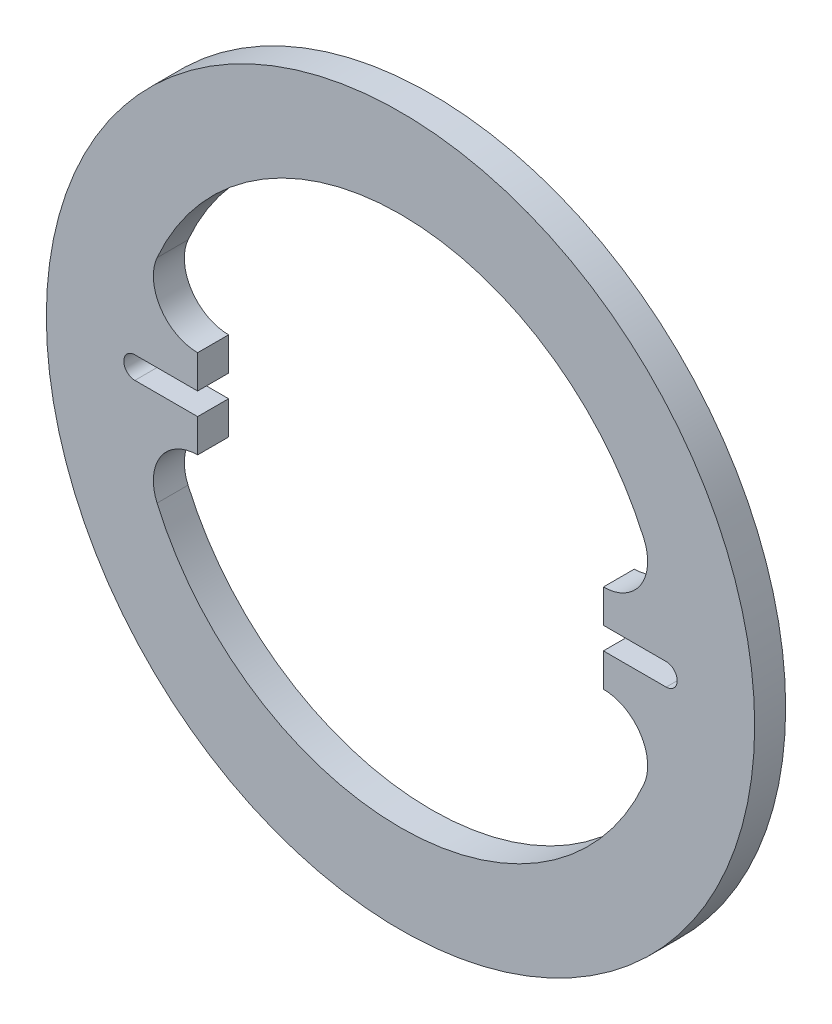
ISO-10303-21;
HEADER;
FILE_DESCRIPTION(('STEP AP214'),'2;1');
FILE_NAME('part.step','',(''),(''),'','','');
FILE_SCHEMA(('AUTOMOTIVE_DESIGN { 1 0 10303 214 1 1 1 1 }'));
ENDSEC;
DATA;
#1=APPLICATION_CONTEXT('core data for automotive mechanical design processes');
#2=APPLICATION_PROTOCOL_DEFINITION('international standard','automotive_design',2000,#1);
#3=PRODUCT_CONTEXT('',#1,'mechanical');
#4=PRODUCT('Part','Part','',(#3));
#5=PRODUCT_RELATED_PRODUCT_CATEGORY('part','',(#4));
#6=PRODUCT_DEFINITION_FORMATION('','',#4);
#7=PRODUCT_DEFINITION_CONTEXT('part definition',#1,'design');
#8=PRODUCT_DEFINITION('design','',#6,#7);
#9=PRODUCT_DEFINITION_SHAPE('','',#8);
#10=(LENGTH_UNIT() NAMED_UNIT(*) SI_UNIT(.MILLI.,.METRE.));
#11=(NAMED_UNIT(*) PLANE_ANGLE_UNIT() SI_UNIT($,.RADIAN.));
#12=(NAMED_UNIT(*) SI_UNIT($,.STERADIAN.) SOLID_ANGLE_UNIT());
#13=UNCERTAINTY_MEASURE_WITH_UNIT(LENGTH_MEASURE(1.E-05),#10,'distance_accuracy_value','');
#14=(GEOMETRIC_REPRESENTATION_CONTEXT(3) GLOBAL_UNCERTAINTY_ASSIGNED_CONTEXT((#13)) GLOBAL_UNIT_ASSIGNED_CONTEXT((#10,
#11,#12)) REPRESENTATION_CONTEXT('',''));
#15=CARTESIAN_POINT('',(0.,0.,0.));
#16=DIRECTION('',(0.,0.,1.));
#17=DIRECTION('',(1.,0.,0.));
#18=AXIS2_PLACEMENT_3D('',#15,#16,#17);
#19=CARTESIAN_POINT('',(0.,0.,8.89));
#20=DIRECTION('',(0.,0.,1.));
#21=DIRECTION('',(1.,0.,0.));
#22=AXIS2_PLACEMENT_3D('',#19,#20,#21);
#23=PLANE('',#22);
#24=DIRECTION('',(0.,-1.,0.));
#25=VECTOR('',#24,1.);
#26=CARTESIAN_POINT('',(-58.1987113259392,-12.7,8.89));
#27=LINE('',#26,#25);
#28=CARTESIAN_POINT('',(-58.198711325939,12.7,8.89));
#29=VERTEX_POINT('',#28);
#30=CARTESIAN_POINT('',(-58.1987113259392,3.17500000000001,8.89));
#31=VERTEX_POINT('',#30);
#32=EDGE_CURVE('E48',#29,#31,#27,.T.);
#33=ORIENTED_EDGE('',*,*,#32,.F.);
#34=CARTESIAN_POINT('',(-58.1987113259392,25.4,8.89));
#35=DIRECTION('',(0.,0.,1.));
#36=DIRECTION('',(1.,0.,0.));
#37=AXIS2_PLACEMENT_3D('',#34,#35,#36);
#38=CIRCLE('',#37,12.7);
#39=CARTESIAN_POINT('',(-69.838453591127,30.48,8.89));
#40=VERTEX_POINT('',#39);
#41=EDGE_CURVE('E196',#40,#29,#38,.T.);
#42=ORIENTED_EDGE('',*,*,#41,.F.);
#43=CARTESIAN_POINT('',(0.,0.,8.89));
#44=DIRECTION('',(0.,0.,1.));
#45=DIRECTION('',(1.,0.,0.));
#46=AXIS2_PLACEMENT_3D('',#43,#44,#45);
#47=CIRCLE('',#46,76.2);
#48=CARTESIAN_POINT('',(69.838453591127,30.48,8.89));
#49=VERTEX_POINT('',#48);
#50=EDGE_CURVE('E203',#49,#40,#47,.T.);
#51=ORIENTED_EDGE('',*,*,#50,.F.);
#52=CARTESIAN_POINT('',(58.1987113259392,25.4,8.89));
#53=DIRECTION('',(0.,0.,1.));
#54=DIRECTION('',(1.,0.,0.));
#55=AXIS2_PLACEMENT_3D('',#52,#53,#54);
#56=CIRCLE('',#55,12.7);
#57=CARTESIAN_POINT('',(58.1987113259393,12.7,8.89));
#58=VERTEX_POINT('',#57);
#59=EDGE_CURVE('E191',#58,#49,#56,.T.);
#60=ORIENTED_EDGE('',*,*,#59,.F.);
#61=DIRECTION('',(0.,1.,0.));
#62=VECTOR('',#61,1.);
#63=CARTESIAN_POINT('',(58.1987113259393,12.7,8.89));
#64=LINE('',#63,#62);
#65=CARTESIAN_POINT('',(58.1987113259392,3.175,8.89));
#66=VERTEX_POINT('',#65);
#67=EDGE_CURVE('E285',#66,#58,#64,.T.);
#68=ORIENTED_EDGE('',*,*,#67,.F.);
#69=DIRECTION('',(-1.,0.,0.));
#70=VECTOR('',#69,1.);
#71=CARTESIAN_POINT('',(76.2,3.17500000000001,8.89));
#72=LINE('',#71,#70);
#73=CARTESIAN_POINT('',(76.2,3.17500000000001,8.89));
#74=VERTEX_POINT('',#73);
#75=EDGE_CURVE('E226',#74,#66,#72,.T.);
#76=ORIENTED_EDGE('',*,*,#75,.F.);
#77=CARTESIAN_POINT('',(76.2,0.,8.89));
#78=DIRECTION('',(0.,0.,1.));
#79=DIRECTION('',(1.,0.,0.));
#80=AXIS2_PLACEMENT_3D('',#77,#78,#79);
#81=CIRCLE('',#80,3.17500000000001);
#82=CARTESIAN_POINT('',(76.2,-3.175,8.89));
#83=VERTEX_POINT('',#82);
#84=EDGE_CURVE('E241',#83,#74,#81,.T.);
#85=ORIENTED_EDGE('',*,*,#84,.F.);
#86=DIRECTION('',(1.,0.,0.));
#87=VECTOR('',#86,1.);
#88=CARTESIAN_POINT('',(76.2,-3.175,8.89));
#89=LINE('',#88,#87);
#90=CARTESIAN_POINT('',(58.1987113259393,-3.17500000000001,8.89));
#91=VERTEX_POINT('',#90);
#92=EDGE_CURVE('E237',#91,#83,#89,.T.);
#93=ORIENTED_EDGE('',*,*,#92,.F.);
#94=CARTESIAN_POINT('',(58.1987113259391,-12.7,8.89));
#95=VERTEX_POINT('',#94);
#96=EDGE_CURVE('E283',#95,#91,#64,.T.);
#97=ORIENTED_EDGE('',*,*,#96,.F.);
#98=CARTESIAN_POINT('',(58.1987113259392,-25.4,8.89));
#99=DIRECTION('',(0.,0.,-1.));
#100=DIRECTION('',(1.,0.,0.));
#101=AXIS2_PLACEMENT_3D('',#98,#99,#100);
#102=CIRCLE('',#101,12.7);
#103=CARTESIAN_POINT('',(69.838453591127,-30.48,8.89));
#104=VERTEX_POINT('',#103);
#105=EDGE_CURVE('E162',#95,#104,#102,.T.);
#106=ORIENTED_EDGE('',*,*,#105,.T.);
#107=CARTESIAN_POINT('',(0.,0.,8.89));
#108=DIRECTION('',(0.,0.,-1.));
#109=DIRECTION('',(1.,0.,0.));
#110=AXIS2_PLACEMENT_3D('',#107,#108,#109);
#111=CIRCLE('',#110,76.2);
#112=CARTESIAN_POINT('',(-69.838453591127,-30.48,8.89));
#113=VERTEX_POINT('',#112);
#114=EDGE_CURVE('E172',#104,#113,#111,.T.);
#115=ORIENTED_EDGE('',*,*,#114,.T.);
#116=CARTESIAN_POINT('',(-58.1987113259392,-25.4,8.89));
#117=DIRECTION('',(0.,0.,-1.));
#118=DIRECTION('',(1.,0.,0.));
#119=AXIS2_PLACEMENT_3D('',#116,#117,#118);
#120=CIRCLE('',#119,12.7);
#121=CARTESIAN_POINT('',(-58.1987113259392,-12.7,8.89));
#122=VERTEX_POINT('',#121);
#123=EDGE_CURVE('E177',#113,#122,#120,.T.);
#124=ORIENTED_EDGE('',*,*,#123,.T.);
#125=CARTESIAN_POINT('',(-58.1987113259392,-3.17500000000001,8.89));
#126=VERTEX_POINT('',#125);
#127=EDGE_CURVE('E280',#126,#122,#27,.T.);
#128=ORIENTED_EDGE('',*,*,#127,.F.);
#129=DIRECTION('',(1.,0.,0.));
#130=VECTOR('',#129,1.);
#131=CARTESIAN_POINT('',(-76.2,-3.175,8.89));
#132=LINE('',#131,#130);
#133=CARTESIAN_POINT('',(-76.2,-3.175,8.89));
#134=VERTEX_POINT('',#133);
#135=EDGE_CURVE('E262',#134,#126,#132,.T.);
#136=ORIENTED_EDGE('',*,*,#135,.F.);
#137=CARTESIAN_POINT('',(-76.2,0.,8.89));
#138=DIRECTION('',(0.,0.,1.));
#139=DIRECTION('',(-1.,0.,0.));
#140=AXIS2_PLACEMENT_3D('',#137,#138,#139);
#141=CIRCLE('',#140,3.17500000000001);
#142=CARTESIAN_POINT('',(-76.2,3.17500000000001,8.89));
#143=VERTEX_POINT('',#142);
#144=EDGE_CURVE('E259',#143,#134,#141,.T.);
#145=ORIENTED_EDGE('',*,*,#144,.F.);
#146=DIRECTION('',(-1.,0.,0.));
#147=VECTOR('',#146,1.);
#148=CARTESIAN_POINT('',(-76.2,3.17500000000001,8.89));
#149=LINE('',#148,#147);
#150=EDGE_CURVE('E254',#31,#143,#149,.T.);
#151=ORIENTED_EDGE('',*,*,#150,.F.);
#152=EDGE_LOOP('',(#33,#42,#51,#60,#68,#76,#85,#93,#97,#106,#115,#124,#128,#136,#145,#151));
#153=FACE_BOUND('',#152,.T.);
#154=CARTESIAN_POINT('',(0.,0.,8.89));
#155=DIRECTION('',(0.,0.,1.));
#156=DIRECTION('',(1.,0.,0.));
#157=AXIS2_PLACEMENT_3D('',#154,#155,#156);
#158=CIRCLE('',#157,101.6);
#159=CARTESIAN_POINT('',(101.6,0.,8.89));
#160=VERTEX_POINT('',#159);
#161=EDGE_CURVE('E213',#160,#160,#158,.T.);
#162=ORIENTED_EDGE('',*,*,#161,.T.);
#163=EDGE_LOOP('',(#162));
#164=FACE_BOUND('',#163,.T.);
#165=ADVANCED_FACE('F33',(#153,#164),#23,.T.);
#166=CARTESIAN_POINT('',(0.,0.,0.));
#167=DIRECTION('',(0.,0.,1.));
#168=DIRECTION('',(1.,0.,0.));
#169=AXIS2_PLACEMENT_3D('',#166,#167,#168);
#170=PLANE('',#169);
#171=CARTESIAN_POINT('',(0.,0.,0.));
#172=DIRECTION('',(0.,0.,1.));
#173=DIRECTION('',(1.,0.,0.));
#174=AXIS2_PLACEMENT_3D('',#171,#172,#173);
#175=CIRCLE('',#174,101.6);
#176=CARTESIAN_POINT('',(101.6,0.,0.));
#177=VERTEX_POINT('',#176);
#178=EDGE_CURVE('E210',#177,#177,#175,.T.);
#179=ORIENTED_EDGE('',*,*,#178,.F.);
#180=EDGE_LOOP('',(#179));
#181=FACE_BOUND('',#180,.T.);
#182=CARTESIAN_POINT('',(-58.1987113259392,25.4,0.));
#183=DIRECTION('',(0.,0.,1.));
#184=DIRECTION('',(1.,0.,0.));
#185=AXIS2_PLACEMENT_3D('',#182,#183,#184);
#186=CIRCLE('',#185,12.7);
#187=CARTESIAN_POINT('',(-69.838453591127,30.48,0.));
#188=VERTEX_POINT('',#187);
#189=CARTESIAN_POINT('',(-58.198711325939,12.7,0.));
#190=VERTEX_POINT('',#189);
#191=EDGE_CURVE('E199',#188,#190,#186,.T.);
#192=ORIENTED_EDGE('',*,*,#191,.T.);
#193=DIRECTION('',(0.,-1.,0.));
#194=VECTOR('',#193,1.);
#195=CARTESIAN_POINT('',(-58.1987113259392,-12.7,0.));
#196=LINE('',#195,#194);
#197=CARTESIAN_POINT('',(-58.1987113259391,3.175,0.));
#198=VERTEX_POINT('',#197);
#199=EDGE_CURVE('E164',#190,#198,#196,.T.);
#200=ORIENTED_EDGE('',*,*,#199,.T.);
#201=DIRECTION('',(-1.,0.,0.));
#202=VECTOR('',#201,1.);
#203=CARTESIAN_POINT('',(-76.2,3.17500000000001,0.));
#204=LINE('',#203,#202);
#205=CARTESIAN_POINT('',(-76.2,3.17500000000001,0.));
#206=VERTEX_POINT('',#205);
#207=EDGE_CURVE('E257',#198,#206,#204,.T.);
#208=ORIENTED_EDGE('',*,*,#207,.T.);
#209=CARTESIAN_POINT('',(-76.2,0.,0.));
#210=DIRECTION('',(0.,0.,1.));
#211=DIRECTION('',(-1.,0.,0.));
#212=AXIS2_PLACEMENT_3D('',#209,#210,#211);
#213=CIRCLE('',#212,3.17500000000001);
#214=CARTESIAN_POINT('',(-76.2,-3.175,0.));
#215=VERTEX_POINT('',#214);
#216=EDGE_CURVE('E250',#206,#215,#213,.T.);
#217=ORIENTED_EDGE('',*,*,#216,.T.);
#218=DIRECTION('',(1.,0.,0.));
#219=VECTOR('',#218,1.);
#220=CARTESIAN_POINT('',(-76.2,-3.175,0.));
#221=LINE('',#220,#219);
#222=CARTESIAN_POINT('',(-58.1987113259392,-3.17500000000001,0.));
#223=VERTEX_POINT('',#222);
#224=EDGE_CURVE('E253',#215,#223,#221,.T.);
#225=ORIENTED_EDGE('',*,*,#224,.T.);
#226=CARTESIAN_POINT('',(-58.1987113259392,-12.7,0.));
#227=VERTEX_POINT('',#226);
#228=EDGE_CURVE('E56',#223,#227,#196,.T.);
#229=ORIENTED_EDGE('',*,*,#228,.T.);
#230=CARTESIAN_POINT('',(-58.1987113259392,-25.4,0.));
#231=DIRECTION('',(0.,0.,-1.));
#232=DIRECTION('',(1.,0.,0.));
#233=AXIS2_PLACEMENT_3D('',#230,#231,#232);
#234=CIRCLE('',#233,12.7);
#235=CARTESIAN_POINT('',(-69.838453591127,-30.48,0.));
#236=VERTEX_POINT('',#235);
#237=EDGE_CURVE('E171',#236,#227,#234,.T.);
#238=ORIENTED_EDGE('',*,*,#237,.F.);
#239=CARTESIAN_POINT('',(0.,0.,0.));
#240=DIRECTION('',(0.,0.,-1.));
#241=DIRECTION('',(1.,0.,0.));
#242=AXIS2_PLACEMENT_3D('',#239,#240,#241);
#243=CIRCLE('',#242,76.2);
#244=CARTESIAN_POINT('',(69.838453591127,-30.48,0.));
#245=VERTEX_POINT('',#244);
#246=EDGE_CURVE('E170',#245,#236,#243,.T.);
#247=ORIENTED_EDGE('',*,*,#246,.F.);
#248=CARTESIAN_POINT('',(58.1987113259392,-25.4,0.));
#249=DIRECTION('',(0.,0.,-1.));
#250=DIRECTION('',(1.,0.,0.));
#251=AXIS2_PLACEMENT_3D('',#248,#249,#250);
#252=CIRCLE('',#251,12.7);
#253=CARTESIAN_POINT('',(58.1987113259391,-12.7,0.));
#254=VERTEX_POINT('',#253);
#255=EDGE_CURVE('E160',#254,#245,#252,.T.);
#256=ORIENTED_EDGE('',*,*,#255,.F.);
#257=DIRECTION('',(0.,1.,0.));
#258=VECTOR('',#257,1.);
#259=CARTESIAN_POINT('',(58.1987113259393,12.7,0.));
#260=LINE('',#259,#258);
#261=CARTESIAN_POINT('',(58.1987113259392,-3.17500000000001,0.));
#262=VERTEX_POINT('',#261);
#263=EDGE_CURVE('E144',#254,#262,#260,.T.);
#264=ORIENTED_EDGE('',*,*,#263,.T.);
#265=DIRECTION('',(1.,0.,0.));
#266=VECTOR('',#265,1.);
#267=CARTESIAN_POINT('',(76.2,-3.175,0.));
#268=LINE('',#267,#266);
#269=CARTESIAN_POINT('',(76.2,-3.175,0.));
#270=VERTEX_POINT('',#269);
#271=EDGE_CURVE('E233',#262,#270,#268,.T.);
#272=ORIENTED_EDGE('',*,*,#271,.T.);
#273=CARTESIAN_POINT('',(76.2,0.,0.));
#274=DIRECTION('',(0.,0.,1.));
#275=DIRECTION('',(1.,0.,0.));
#276=AXIS2_PLACEMENT_3D('',#273,#274,#275);
#277=CIRCLE('',#276,3.17500000000001);
#278=CARTESIAN_POINT('',(76.2,3.17500000000001,0.));
#279=VERTEX_POINT('',#278);
#280=EDGE_CURVE('E232',#270,#279,#277,.T.);
#281=ORIENTED_EDGE('',*,*,#280,.T.);
#282=DIRECTION('',(-1.,0.,0.));
#283=VECTOR('',#282,1.);
#284=CARTESIAN_POINT('',(76.2,3.17500000000001,0.));
#285=LINE('',#284,#283);
#286=CARTESIAN_POINT('',(58.1987113259393,3.17500000000001,0.));
#287=VERTEX_POINT('',#286);
#288=EDGE_CURVE('E223',#279,#287,#285,.T.);
#289=ORIENTED_EDGE('',*,*,#288,.T.);
#290=CARTESIAN_POINT('',(58.1987113259393,12.7,0.));
#291=VERTEX_POINT('',#290);
#292=EDGE_CURVE('E154',#287,#291,#260,.T.);
#293=ORIENTED_EDGE('',*,*,#292,.T.);
#294=CARTESIAN_POINT('',(58.1987113259392,25.4,0.));
#295=DIRECTION('',(0.,0.,1.));
#296=DIRECTION('',(1.,0.,0.));
#297=AXIS2_PLACEMENT_3D('',#294,#295,#296);
#298=CIRCLE('',#297,12.7);
#299=CARTESIAN_POINT('',(69.838453591127,30.48,0.));
#300=VERTEX_POINT('',#299);
#301=EDGE_CURVE('E193',#291,#300,#298,.T.);
#302=ORIENTED_EDGE('',*,*,#301,.T.);
#303=CARTESIAN_POINT('',(0.,0.,0.));
#304=DIRECTION('',(0.,0.,1.));
#305=DIRECTION('',(1.,0.,0.));
#306=AXIS2_PLACEMENT_3D('',#303,#304,#305);
#307=CIRCLE('',#306,76.2);
#308=EDGE_CURVE('E195',#300,#188,#307,.T.);
#309=ORIENTED_EDGE('',*,*,#308,.T.);
#310=EDGE_LOOP('',(#192,#200,#208,#217,#225,#229,#238,#247,#256,#264,#272,#281,#289,#293,#302,#309));
#311=FACE_BOUND('',#310,.T.);
#312=ADVANCED_FACE('F168',(#181,#311),#170,.F.);
#313=CARTESIAN_POINT('',(0.,0.,8.89));
#314=DIRECTION('',(0.,0.,-1.));
#315=DIRECTION('',(-1.,0.,0.));
#316=AXIS2_PLACEMENT_3D('',#313,#314,#315);
#317=CYLINDRICAL_SURFACE('',#316,101.6);
#318=ORIENTED_EDGE('',*,*,#161,.F.);
#319=EDGE_LOOP('',(#318));
#320=FACE_BOUND('',#319,.T.);
#321=ORIENTED_EDGE('',*,*,#178,.T.);
#322=EDGE_LOOP('',(#321));
#323=FACE_BOUND('',#322,.T.);
#324=ADVANCED_FACE('F35',(#320,#323),#317,.T.);
#325=CARTESIAN_POINT('',(58.1987113259392,25.4,0.));
#326=DIRECTION('',(0.,0.,1.));
#327=DIRECTION('',(1.,0.,0.));
#328=AXIS2_PLACEMENT_3D('',#325,#326,#327);
#329=CYLINDRICAL_SURFACE('',#328,12.7);
#330=ORIENTED_EDGE('',*,*,#301,.F.);
#331=DIRECTION('',(0.,0.,1.));
#332=VECTOR('',#331,1.);
#333=CARTESIAN_POINT('',(58.1987113259393,12.7,0.));
#334=LINE('',#333,#332);
#335=EDGE_CURVE('E163',#291,#58,#334,.T.);
#336=ORIENTED_EDGE('',*,*,#335,.T.);
#337=ORIENTED_EDGE('',*,*,#59,.T.);
#338=DIRECTION('',(0.,0.,1.));
#339=VECTOR('',#338,1.);
#340=CARTESIAN_POINT('',(69.838453591127,30.48,0.));
#341=LINE('',#340,#339);
#342=EDGE_CURVE('E201',#300,#49,#341,.T.);
#343=ORIENTED_EDGE('',*,*,#342,.F.);
#344=EDGE_LOOP('',(#330,#336,#337,#343));
#345=FACE_BOUND('',#344,.T.);
#346=ADVANCED_FACE('F311',(#345),#329,.F.);
#347=CARTESIAN_POINT('',(-58.1987113259392,25.4,0.));
#348=DIRECTION('',(0.,0.,1.));
#349=DIRECTION('',(1.,0.,0.));
#350=AXIS2_PLACEMENT_3D('',#347,#348,#349);
#351=CYLINDRICAL_SURFACE('',#350,12.7);
#352=ORIENTED_EDGE('',*,*,#41,.T.);
#353=DIRECTION('',(0.,0.,1.));
#354=VECTOR('',#353,1.);
#355=CARTESIAN_POINT('',(-58.198711325939,12.7,0.));
#356=LINE('',#355,#354);
#357=EDGE_CURVE('E291',#190,#29,#356,.T.);
#358=ORIENTED_EDGE('',*,*,#357,.F.);
#359=ORIENTED_EDGE('',*,*,#191,.F.);
#360=DIRECTION('',(0.,0.,1.));
#361=VECTOR('',#360,1.);
#362=CARTESIAN_POINT('',(-69.838453591127,30.48,0.));
#363=LINE('',#362,#361);
#364=EDGE_CURVE('E208',#188,#40,#363,.T.);
#365=ORIENTED_EDGE('',*,*,#364,.T.);
#366=EDGE_LOOP('',(#352,#358,#359,#365));
#367=FACE_BOUND('',#366,.T.);
#368=ADVANCED_FACE('F303',(#367),#351,.F.);
#369=CARTESIAN_POINT('',(0.,0.,0.));
#370=DIRECTION('',(0.,0.,1.));
#371=DIRECTION('',(1.,0.,0.));
#372=AXIS2_PLACEMENT_3D('',#369,#370,#371);
#373=CYLINDRICAL_SURFACE('',#372,76.2);
#374=ORIENTED_EDGE('',*,*,#50,.T.);
#375=ORIENTED_EDGE('',*,*,#364,.F.);
#376=ORIENTED_EDGE('',*,*,#308,.F.);
#377=ORIENTED_EDGE('',*,*,#342,.T.);
#378=EDGE_LOOP('',(#374,#375,#376,#377));
#379=FACE_BOUND('',#378,.T.);
#380=ADVANCED_FACE('F307',(#379),#373,.F.);
#381=CARTESIAN_POINT('',(58.1987113259392,-25.4,0.));
#382=DIRECTION('',(0.,0.,1.));
#383=DIRECTION('',(1.,0.,0.));
#384=AXIS2_PLACEMENT_3D('',#381,#382,#383);
#385=CYLINDRICAL_SURFACE('',#384,12.7);
#386=DIRECTION('',(0.,0.,1.));
#387=VECTOR('',#386,1.);
#388=CARTESIAN_POINT('',(58.1987113259391,-12.7,0.));
#389=LINE('',#388,#387);
#390=EDGE_CURVE('E147',#254,#95,#389,.T.);
#391=ORIENTED_EDGE('',*,*,#390,.F.);
#392=ORIENTED_EDGE('',*,*,#255,.T.);
#393=DIRECTION('',(0.,0.,1.));
#394=VECTOR('',#393,1.);
#395=CARTESIAN_POINT('',(69.838453591127,-30.48,0.));
#396=LINE('',#395,#394);
#397=EDGE_CURVE('E189',#245,#104,#396,.T.);
#398=ORIENTED_EDGE('',*,*,#397,.T.);
#399=ORIENTED_EDGE('',*,*,#105,.F.);
#400=EDGE_LOOP('',(#391,#392,#398,#399));
#401=FACE_BOUND('',#400,.T.);
#402=ADVANCED_FACE('F158',(#401),#385,.F.);
#403=CARTESIAN_POINT('',(0.,0.,0.));
#404=DIRECTION('',(0.,0.,1.));
#405=DIRECTION('',(1.,0.,0.));
#406=AXIS2_PLACEMENT_3D('',#403,#404,#405);
#407=CYLINDRICAL_SURFACE('',#406,76.2);
#408=ORIENTED_EDGE('',*,*,#114,.F.);
#409=ORIENTED_EDGE('',*,*,#397,.F.);
#410=ORIENTED_EDGE('',*,*,#246,.T.);
#411=DIRECTION('',(0.,0.,1.));
#412=VECTOR('',#411,1.);
#413=CARTESIAN_POINT('',(-69.838453591127,-30.48,0.));
#414=LINE('',#413,#412);
#415=EDGE_CURVE('E184',#236,#113,#414,.T.);
#416=ORIENTED_EDGE('',*,*,#415,.T.);
#417=EDGE_LOOP('',(#408,#409,#410,#416));
#418=FACE_BOUND('',#417,.T.);
#419=ADVANCED_FACE('F318',(#418),#407,.F.);
#420=CARTESIAN_POINT('',(-58.1987113259392,-25.4,0.));
#421=DIRECTION('',(0.,0.,1.));
#422=DIRECTION('',(1.,0.,0.));
#423=AXIS2_PLACEMENT_3D('',#420,#421,#422);
#424=CYLINDRICAL_SURFACE('',#423,12.7);
#425=DIRECTION('',(0.,0.,1.));
#426=VECTOR('',#425,1.);
#427=CARTESIAN_POINT('',(-58.1987113259392,-12.7,0.));
#428=LINE('',#427,#426);
#429=EDGE_CURVE('E289',#227,#122,#428,.T.);
#430=ORIENTED_EDGE('',*,*,#429,.T.);
#431=ORIENTED_EDGE('',*,*,#123,.F.);
#432=ORIENTED_EDGE('',*,*,#415,.F.);
#433=ORIENTED_EDGE('',*,*,#237,.T.);
#434=EDGE_LOOP('',(#430,#431,#432,#433));
#435=FACE_BOUND('',#434,.T.);
#436=ADVANCED_FACE('F315',(#435),#424,.F.);
#437=CARTESIAN_POINT('',(-76.2,0.,0.));
#438=DIRECTION('',(0.,0.,1.));
#439=DIRECTION('',(1.,0.,0.));
#440=AXIS2_PLACEMENT_3D('',#437,#438,#439);
#441=CYLINDRICAL_SURFACE('',#440,3.17500000000001);
#442=ORIENTED_EDGE('',*,*,#144,.T.);
#443=DIRECTION('',(0.,0.,1.));
#444=VECTOR('',#443,1.);
#445=CARTESIAN_POINT('',(-76.2,-3.175,0.));
#446=LINE('',#445,#444);
#447=EDGE_CURVE('E180',#215,#134,#446,.T.);
#448=ORIENTED_EDGE('',*,*,#447,.F.);
#449=ORIENTED_EDGE('',*,*,#216,.F.);
#450=DIRECTION('',(0.,0.,1.));
#451=VECTOR('',#450,1.);
#452=CARTESIAN_POINT('',(-76.2,3.17500000000001,0.));
#453=LINE('',#452,#451);
#454=EDGE_CURVE('E244',#206,#143,#453,.T.);
#455=ORIENTED_EDGE('',*,*,#454,.T.);
#456=EDGE_LOOP('',(#442,#448,#449,#455));
#457=FACE_BOUND('',#456,.T.);
#458=ADVANCED_FACE('F275',(#457),#441,.F.);
#459=CARTESIAN_POINT('',(-76.2,3.17500000000001,0.));
#460=DIRECTION('',(0.,1.,0.));
#461=DIRECTION('',(-1.,0.,0.));
#462=AXIS2_PLACEMENT_3D('',#459,#460,#461);
#463=PLANE('',#462);
#464=ORIENTED_EDGE('',*,*,#207,.F.);
#465=DIRECTION('',(0.,0.,1.));
#466=VECTOR('',#465,1.);
#467=CARTESIAN_POINT('',(-58.1987113259391,3.17500000000001,0.));
#468=LINE('',#467,#466);
#469=EDGE_CURVE('E263',#198,#31,#468,.T.);
#470=ORIENTED_EDGE('',*,*,#469,.T.);
#471=ORIENTED_EDGE('',*,*,#150,.T.);
#472=ORIENTED_EDGE('',*,*,#454,.F.);
#473=EDGE_LOOP('',(#464,#470,#471,#472));
#474=FACE_BOUND('',#473,.T.);
#475=ADVANCED_FACE('F297',(#474),#463,.F.);
#476=CARTESIAN_POINT('',(-76.2,-3.175,0.));
#477=DIRECTION('',(0.,-1.,0.));
#478=DIRECTION('',(1.,0.,0.));
#479=AXIS2_PLACEMENT_3D('',#476,#477,#478);
#480=PLANE('',#479);
#481=ORIENTED_EDGE('',*,*,#135,.T.);
#482=DIRECTION('',(0.,0.,-1.));
#483=VECTOR('',#482,1.);
#484=CARTESIAN_POINT('',(-58.1987113259392,-3.17500000000001,0.));
#485=LINE('',#484,#483);
#486=EDGE_CURVE('E11',#126,#223,#485,.T.);
#487=ORIENTED_EDGE('',*,*,#486,.T.);
#488=ORIENTED_EDGE('',*,*,#224,.F.);
#489=ORIENTED_EDGE('',*,*,#447,.T.);
#490=EDGE_LOOP('',(#481,#487,#488,#489));
#491=FACE_BOUND('',#490,.T.);
#492=ADVANCED_FACE('F273',(#491),#480,.F.);
#493=CARTESIAN_POINT('',(76.2,0.,0.));
#494=DIRECTION('',(0.,0.,1.));
#495=DIRECTION('',(1.,0.,0.));
#496=AXIS2_PLACEMENT_3D('',#493,#494,#495);
#497=CYLINDRICAL_SURFACE('',#496,3.17500000000001);
#498=ORIENTED_EDGE('',*,*,#84,.T.);
#499=DIRECTION('',(0.,0.,1.));
#500=VECTOR('',#499,1.);
#501=CARTESIAN_POINT('',(76.2,3.17500000000001,0.));
#502=LINE('',#501,#500);
#503=EDGE_CURVE('E235',#279,#74,#502,.T.);
#504=ORIENTED_EDGE('',*,*,#503,.F.);
#505=ORIENTED_EDGE('',*,*,#280,.F.);
#506=DIRECTION('',(0.,0.,1.));
#507=VECTOR('',#506,1.);
#508=CARTESIAN_POINT('',(76.2,-3.175,0.));
#509=LINE('',#508,#507);
#510=EDGE_CURVE('E186',#270,#83,#509,.T.);
#511=ORIENTED_EDGE('',*,*,#510,.T.);
#512=EDGE_LOOP('',(#498,#504,#505,#511));
#513=FACE_BOUND('',#512,.T.);
#514=ADVANCED_FACE('F325',(#513),#497,.F.);
#515=CARTESIAN_POINT('',(76.2,-3.175,0.));
#516=DIRECTION('',(0.,-1.,0.));
#517=DIRECTION('',(1.,0.,0.));
#518=AXIS2_PLACEMENT_3D('',#515,#516,#517);
#519=PLANE('',#518);
#520=ORIENTED_EDGE('',*,*,#271,.F.);
#521=DIRECTION('',(0.,0.,1.));
#522=VECTOR('',#521,1.);
#523=CARTESIAN_POINT('',(58.1987113259392,-3.17500000000001,0.));
#524=LINE('',#523,#522);
#525=EDGE_CURVE('E150',#262,#91,#524,.T.);
#526=ORIENTED_EDGE('',*,*,#525,.T.);
#527=ORIENTED_EDGE('',*,*,#92,.T.);
#528=ORIENTED_EDGE('',*,*,#510,.F.);
#529=EDGE_LOOP('',(#520,#526,#527,#528));
#530=FACE_BOUND('',#529,.T.);
#531=ADVANCED_FACE('F322',(#530),#519,.F.);
#532=CARTESIAN_POINT('',(76.2,3.17500000000001,0.));
#533=DIRECTION('',(0.,1.,0.));
#534=DIRECTION('',(-1.,0.,0.));
#535=AXIS2_PLACEMENT_3D('',#532,#533,#534);
#536=PLANE('',#535);
#537=ORIENTED_EDGE('',*,*,#75,.T.);
#538=DIRECTION('',(0.,0.,-1.));
#539=VECTOR('',#538,1.);
#540=CARTESIAN_POINT('',(58.1987113259392,3.17500000000001,0.));
#541=LINE('',#540,#539);
#542=EDGE_CURVE('E41',#66,#287,#541,.T.);
#543=ORIENTED_EDGE('',*,*,#542,.T.);
#544=ORIENTED_EDGE('',*,*,#288,.F.);
#545=ORIENTED_EDGE('',*,*,#503,.T.);
#546=EDGE_LOOP('',(#537,#543,#544,#545));
#547=FACE_BOUND('',#546,.T.);
#548=ADVANCED_FACE('F222',(#547),#536,.F.);
#549=CARTESIAN_POINT('',(58.1987113259393,12.7,0.));
#550=DIRECTION('',(1.,0.,0.));
#551=DIRECTION('',(0.,1.,0.));
#552=AXIS2_PLACEMENT_3D('',#549,#550,#551);
#553=PLANE('',#552);
#554=ORIENTED_EDGE('',*,*,#67,.T.);
#555=ORIENTED_EDGE('',*,*,#335,.F.);
#556=ORIENTED_EDGE('',*,*,#292,.F.);
#557=ORIENTED_EDGE('',*,*,#542,.F.);
#558=EDGE_LOOP('',(#554,#555,#556,#557));
#559=FACE_BOUND('',#558,.T.);
#560=ADVANCED_FACE('F312',(#559),#553,.F.);
#561=ORIENTED_EDGE('',*,*,#263,.F.);
#562=ORIENTED_EDGE('',*,*,#390,.T.);
#563=ORIENTED_EDGE('',*,*,#96,.T.);
#564=ORIENTED_EDGE('',*,*,#525,.F.);
#565=EDGE_LOOP('',(#561,#562,#563,#564));
#566=FACE_BOUND('',#565,.T.);
#567=ADVANCED_FACE('F146',(#566),#553,.F.);
#568=CARTESIAN_POINT('',(-58.1987113259392,-12.7,0.));
#569=DIRECTION('',(-1.,0.,0.));
#570=DIRECTION('',(0.,-1.,0.));
#571=AXIS2_PLACEMENT_3D('',#568,#569,#570);
#572=PLANE('',#571);
#573=ORIENTED_EDGE('',*,*,#127,.T.);
#574=ORIENTED_EDGE('',*,*,#429,.F.);
#575=ORIENTED_EDGE('',*,*,#228,.F.);
#576=ORIENTED_EDGE('',*,*,#486,.F.);
#577=EDGE_LOOP('',(#573,#574,#575,#576));
#578=FACE_BOUND('',#577,.T.);
#579=ADVANCED_FACE('F397',(#578),#572,.F.);
#580=ORIENTED_EDGE('',*,*,#199,.F.);
#581=ORIENTED_EDGE('',*,*,#357,.T.);
#582=ORIENTED_EDGE('',*,*,#32,.T.);
#583=ORIENTED_EDGE('',*,*,#469,.F.);
#584=EDGE_LOOP('',(#580,#581,#582,#583));
#585=FACE_BOUND('',#584,.T.);
#586=ADVANCED_FACE('F405',(#585),#572,.F.);
#587=CLOSED_SHELL('',(#165,#312,#324,#346,#368,#380,#402,#419,#436,#458,#475,#492,#514,#531,
#548,#560,#567,#579,#586));
#588=MANIFOLD_SOLID_BREP('B2',#587);
#589=ADVANCED_BREP_SHAPE_REPRESENTATION('',(#18,#588),#14);
#590=SHAPE_DEFINITION_REPRESENTATION(#9,#589);
ENDSEC;
END-ISO-10303-21;
